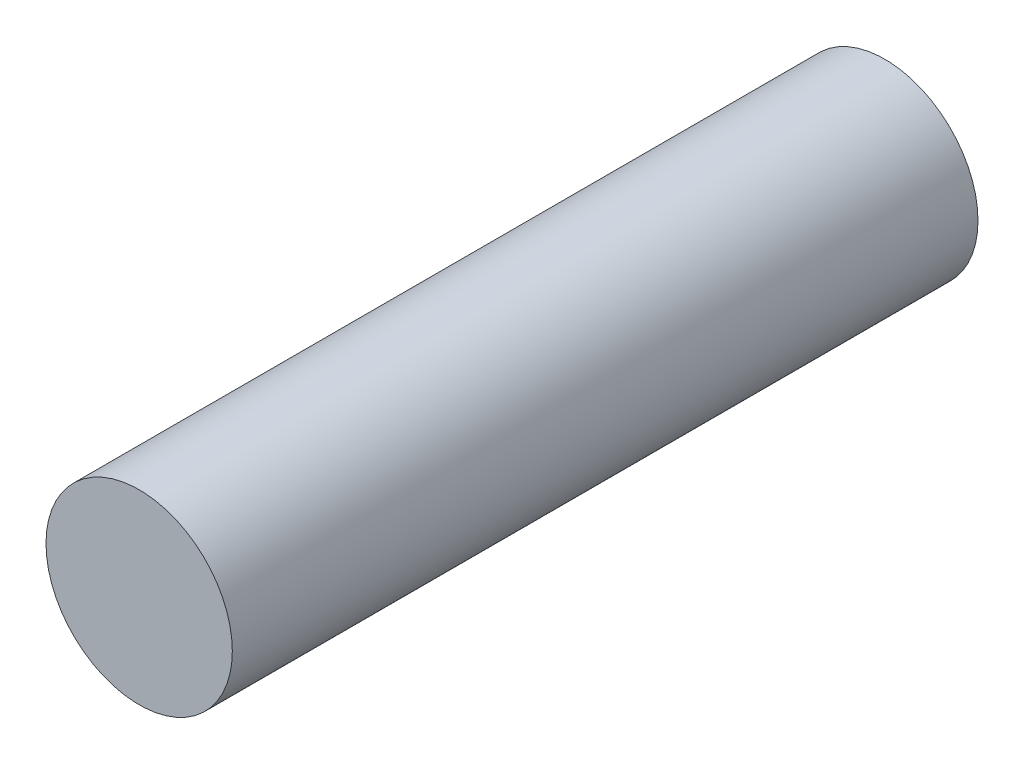
ISO-10303-21;
HEADER;
FILE_DESCRIPTION(('STEP AP214'),'2;1');
FILE_NAME('part.step','',(''),(''),'','','');
FILE_SCHEMA(('AUTOMOTIVE_DESIGN { 1 0 10303 214 1 1 1 1 }'));
ENDSEC;
DATA;
#1=APPLICATION_CONTEXT('core data for automotive mechanical design processes');
#2=APPLICATION_PROTOCOL_DEFINITION('international standard','automotive_design',2000,#1);
#3=PRODUCT_CONTEXT('',#1,'mechanical');
#4=PRODUCT('Part','Part','',(#3));
#5=PRODUCT_RELATED_PRODUCT_CATEGORY('part','',(#4));
#6=PRODUCT_DEFINITION_FORMATION('','',#4);
#7=PRODUCT_DEFINITION_CONTEXT('part definition',#1,'design');
#8=PRODUCT_DEFINITION('design','',#6,#7);
#9=PRODUCT_DEFINITION_SHAPE('','',#8);
#10=(LENGTH_UNIT() NAMED_UNIT(*) SI_UNIT(.MILLI.,.METRE.));
#11=(NAMED_UNIT(*) PLANE_ANGLE_UNIT() SI_UNIT($,.RADIAN.));
#12=(NAMED_UNIT(*) SI_UNIT($,.STERADIAN.) SOLID_ANGLE_UNIT());
#13=UNCERTAINTY_MEASURE_WITH_UNIT(LENGTH_MEASURE(1.E-05),#10,'distance_accuracy_value','');
#14=(GEOMETRIC_REPRESENTATION_CONTEXT(3) GLOBAL_UNCERTAINTY_ASSIGNED_CONTEXT((#13)) GLOBAL_UNIT_ASSIGNED_CONTEXT((#10,
#11,#12)) REPRESENTATION_CONTEXT('',''));
#15=CARTESIAN_POINT('',(0.,0.,0.));
#16=DIRECTION('',(0.,0.,1.));
#17=DIRECTION('',(1.,0.,0.));
#18=AXIS2_PLACEMENT_3D('',#15,#16,#17);
#19=CARTESIAN_POINT('',(0.,0.,38.1));
#20=DIRECTION('',(0.,0.,-1.));
#21=DIRECTION('',(-1.,0.,0.));
#22=AXIS2_PLACEMENT_3D('',#19,#20,#21);
#23=CYLINDRICAL_SURFACE('',#22,4.76);
#24=CARTESIAN_POINT('',(0.,0.,38.1));
#25=DIRECTION('',(0.,0.,1.));
#26=DIRECTION('',(1.,0.,0.));
#27=AXIS2_PLACEMENT_3D('',#24,#25,#26);
#28=CIRCLE('',#27,4.76);
#29=CARTESIAN_POINT('',(-4.76,0.,38.1));
#30=VERTEX_POINT('',#29);
#31=EDGE_CURVE('E10',#30,#30,#28,.T.);
#32=CARTESIAN_POINT('',(0.,0.,0.));
#33=DIRECTION('',(0.,0.,1.));
#34=DIRECTION('',(1.,0.,0.));
#35=AXIS2_PLACEMENT_3D('',#32,#33,#34);
#36=CIRCLE('',#35,4.76);
#37=CARTESIAN_POINT('',(-4.76,0.,0.));
#38=VERTEX_POINT('',#37);
#39=EDGE_CURVE('E46',#38,#38,#36,.T.);
#40=CARTESIAN_POINT('',(-4.76,0.,38.1));
#41=CARTESIAN_POINT('',(-4.76,0.,37.703125));
#42=CARTESIAN_POINT('',(-4.76,0.,37.30625));
#43=CARTESIAN_POINT('',(-4.76,0.,36.5125));
#44=CARTESIAN_POINT('',(-4.76,0.,36.115625));
#45=CARTESIAN_POINT('',(-4.76,0.,35.321875));
#46=CARTESIAN_POINT('',(-4.76,0.,34.925));
#47=CARTESIAN_POINT('',(-4.76,0.,34.13125));
#48=CARTESIAN_POINT('',(-4.76,0.,33.734375));
#49=CARTESIAN_POINT('',(-4.76,0.,32.940625));
#50=CARTESIAN_POINT('',(-4.76,0.,32.54375));
#51=CARTESIAN_POINT('',(-4.76,0.,31.75));
#52=CARTESIAN_POINT('',(-4.76,0.,31.353125));
#53=CARTESIAN_POINT('',(-4.76,0.,30.559375));
#54=CARTESIAN_POINT('',(-4.76,0.,30.1625));
#55=CARTESIAN_POINT('',(-4.76,0.,29.36875));
#56=CARTESIAN_POINT('',(-4.76,0.,28.971875));
#57=CARTESIAN_POINT('',(-4.76,0.,28.178125));
#58=CARTESIAN_POINT('',(-4.76,0.,27.78125));
#59=CARTESIAN_POINT('',(-4.76,0.,26.9875));
#60=CARTESIAN_POINT('',(-4.76,0.,26.590625));
#61=CARTESIAN_POINT('',(-4.76,0.,25.796875));
#62=CARTESIAN_POINT('',(-4.76,0.,25.4));
#63=CARTESIAN_POINT('',(-4.76,0.,24.60625));
#64=CARTESIAN_POINT('',(-4.76,0.,24.209375));
#65=CARTESIAN_POINT('',(-4.76,0.,23.415625));
#66=CARTESIAN_POINT('',(-4.76,0.,23.01875));
#67=CARTESIAN_POINT('',(-4.76,0.,22.225));
#68=CARTESIAN_POINT('',(-4.76,0.,21.828125));
#69=CARTESIAN_POINT('',(-4.76,0.,21.034375));
#70=CARTESIAN_POINT('',(-4.76,0.,20.6375));
#71=CARTESIAN_POINT('',(-4.76,0.,19.84375));
#72=CARTESIAN_POINT('',(-4.76,0.,19.446875));
#73=CARTESIAN_POINT('',(-4.76,0.,18.653125));
#74=CARTESIAN_POINT('',(-4.76,0.,18.25625));
#75=CARTESIAN_POINT('',(-4.76,0.,17.4625));
#76=CARTESIAN_POINT('',(-4.76,0.,17.065625));
#77=CARTESIAN_POINT('',(-4.76,0.,16.271875));
#78=CARTESIAN_POINT('',(-4.76,0.,15.875));
#79=CARTESIAN_POINT('',(-4.76,0.,15.08125));
#80=CARTESIAN_POINT('',(-4.76,0.,14.684375));
#81=CARTESIAN_POINT('',(-4.76,0.,13.890625));
#82=CARTESIAN_POINT('',(-4.76,0.,13.49375));
#83=CARTESIAN_POINT('',(-4.76,0.,12.7));
#84=CARTESIAN_POINT('',(-4.76,0.,12.303125));
#85=CARTESIAN_POINT('',(-4.76,0.,11.509375));
#86=CARTESIAN_POINT('',(-4.76,0.,11.1125));
#87=CARTESIAN_POINT('',(-4.76,0.,10.31875));
#88=CARTESIAN_POINT('',(-4.76,0.,9.92187499999999));
#89=CARTESIAN_POINT('',(-4.76,0.,9.128125));
#90=CARTESIAN_POINT('',(-4.76,0.,8.73124999999999));
#91=CARTESIAN_POINT('',(-4.76,0.,7.93749999999999));
#92=CARTESIAN_POINT('',(-4.76,0.,7.54062499999999));
#93=CARTESIAN_POINT('',(-4.76,0.,6.746875));
#94=CARTESIAN_POINT('',(-4.76,0.,6.35));
#95=CARTESIAN_POINT('',(-4.76,0.,5.55625));
#96=CARTESIAN_POINT('',(-4.76,0.,5.159375));
#97=CARTESIAN_POINT('',(-4.76,0.,4.365625));
#98=CARTESIAN_POINT('',(-4.76,0.,3.96875));
#99=CARTESIAN_POINT('',(-4.76,0.,3.175));
#100=CARTESIAN_POINT('',(-4.76,0.,2.778125));
#101=CARTESIAN_POINT('',(-4.76,0.,1.984375));
#102=CARTESIAN_POINT('',(-4.76,0.,1.5875));
#103=CARTESIAN_POINT('',(-4.76,0.,0.79375));
#104=CARTESIAN_POINT('',(-4.76,0.,0.396875));
#105=CARTESIAN_POINT('',(-4.76,0.,0.));
#106=B_SPLINE_CURVE_WITH_KNOTS('',3,(#40,#41,#42,#43,#44,#45,#46,#47,#48,#49,#50,#51,#52,#53,
#54,#55,#56,#57,#58,#59,#60,#61,#62,#63,#64,#65,#66,#67,#68,#69,#70,#71,#72,#73,#74,#75,#76,#77,
#78,#79,#80,#81,#82,#83,#84,#85,#86,#87,#88,#89,#90,#91,#92,#93,#94,#95,#96,#97,#98,#99,#100,
#101,#102,#103,#104,#105),.UNSPECIFIED.,.F.,.F.,(4,2,2,2,2,2,2,2,2,2,2,2,2,2,2,2,2,2,2,2,2,2,2,
2,2,2,2,2,2,2,2,2,4),(0.,1.190625,2.38125,3.571875,4.7625,5.953125,7.14375,8.334375,
9.52500000000001,10.715625,11.90625,13.096875,14.2875,15.478125,16.66875,17.859375,19.05,
20.240625,21.43125,22.621875,23.8125,25.003125,26.19375,27.384375,28.575,29.765625,30.95625,
32.146875,33.3375,34.528125,35.71875,36.909375,38.1),.UNSPECIFIED.);
#107=EDGE_CURVE('BSEAM43',#30,#38,#106,.T.);
#108=ORIENTED_EDGE('',*,*,#31,.F.);
#109=ORIENTED_EDGE('',*,*,#39,.T.);
#110=ORIENTED_EDGE('',*,*,#107,.T.);
#111=ORIENTED_EDGE('',*,*,#107,.F.);
#112=EDGE_LOOP('',(#108,#110,#109,#111));
#113=FACE_BOUND('',#112,.T.);
#114=ADVANCED_FACE('F43',(#113),#23,.T.);
#115=CARTESIAN_POINT('',(0.,0.,38.1));
#116=DIRECTION('',(0.,0.,1.));
#117=DIRECTION('',(1.,0.,0.));
#118=AXIS2_PLACEMENT_3D('',#115,#116,#117);
#119=PLANE('',#118);
#120=ORIENTED_EDGE('',*,*,#31,.T.);
#121=EDGE_LOOP('',(#120));
#122=FACE_BOUND('',#121,.T.);
#123=ADVANCED_FACE('F60',(#122),#119,.T.);
#124=CARTESIAN_POINT('',(0.,0.,0.));
#125=DIRECTION('',(0.,0.,1.));
#126=DIRECTION('',(1.,0.,0.));
#127=AXIS2_PLACEMENT_3D('',#124,#125,#126);
#128=PLANE('',#127);
#129=ORIENTED_EDGE('',*,*,#39,.F.);
#130=EDGE_LOOP('',(#129));
#131=FACE_BOUND('',#130,.T.);
#132=ADVANCED_FACE('F58',(#131),#128,.F.);
#133=CLOSED_SHELL('',(#114,#123,#132));
#134=MANIFOLD_SOLID_BREP('B2',#133);
#135=ADVANCED_BREP_SHAPE_REPRESENTATION('',(#18,#134),#14);
#136=SHAPE_DEFINITION_REPRESENTATION(#9,#135);
ENDSEC;
END-ISO-10303-21;
